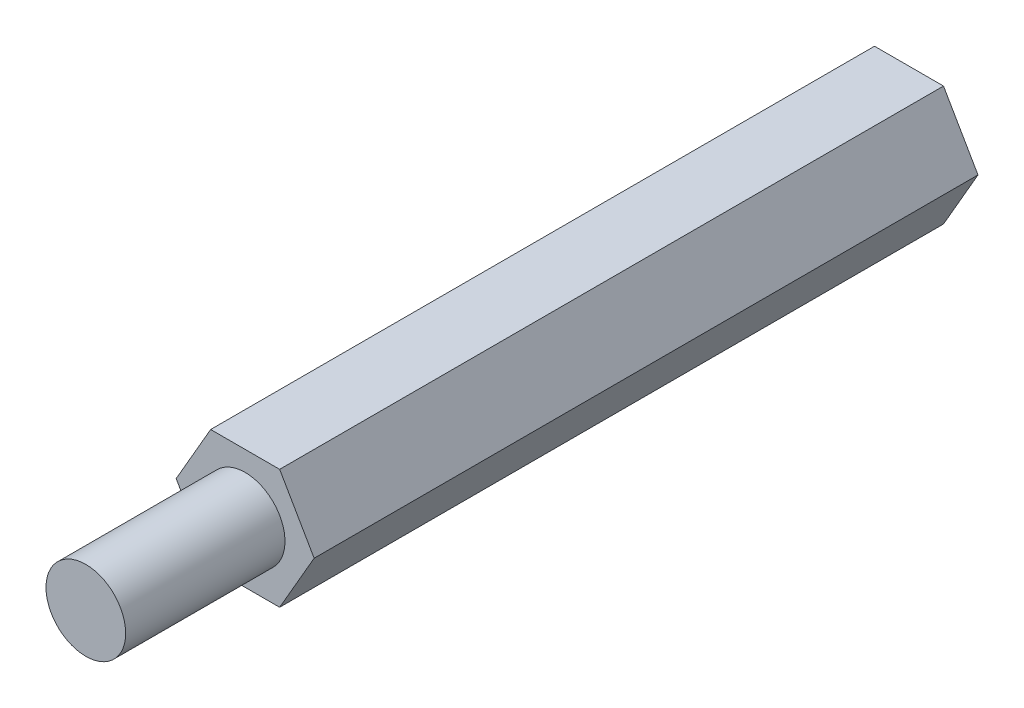
ISO-10303-21;
HEADER;
FILE_DESCRIPTION(('STEP AP214'),'2;1');
FILE_NAME('part.step','',(''),(''),'','','');
FILE_SCHEMA(('AUTOMOTIVE_DESIGN { 1 0 10303 214 1 1 1 1 }'));
ENDSEC;
DATA;
#1=APPLICATION_CONTEXT('core data for automotive mechanical design processes');
#2=APPLICATION_PROTOCOL_DEFINITION('international standard','automotive_design',2000,#1);
#3=PRODUCT_CONTEXT('',#1,'mechanical');
#4=PRODUCT('Part','Part','',(#3));
#5=PRODUCT_RELATED_PRODUCT_CATEGORY('part','',(#4));
#6=PRODUCT_DEFINITION_FORMATION('','',#4);
#7=PRODUCT_DEFINITION_CONTEXT('part definition',#1,'design');
#8=PRODUCT_DEFINITION('design','',#6,#7);
#9=PRODUCT_DEFINITION_SHAPE('','',#8);
#10=(LENGTH_UNIT() NAMED_UNIT(*) SI_UNIT(.MILLI.,.METRE.));
#11=(NAMED_UNIT(*) PLANE_ANGLE_UNIT() SI_UNIT($,.RADIAN.));
#12=(NAMED_UNIT(*) SI_UNIT($,.STERADIAN.) SOLID_ANGLE_UNIT());
#13=UNCERTAINTY_MEASURE_WITH_UNIT(LENGTH_MEASURE(1.E-05),#10,'distance_accuracy_value','');
#14=(GEOMETRIC_REPRESENTATION_CONTEXT(3) GLOBAL_UNCERTAINTY_ASSIGNED_CONTEXT((#13)) GLOBAL_UNIT_ASSIGNED_CONTEXT((#10,
#11,#12)) REPRESENTATION_CONTEXT('',''));
#15=CARTESIAN_POINT('',(0.,0.,0.));
#16=DIRECTION('',(0.,0.,1.));
#17=DIRECTION('',(1.,0.,0.));
#18=AXIS2_PLACEMENT_3D('',#15,#16,#17);
#19=CARTESIAN_POINT('',(0.,0.,6.));
#20=DIRECTION('',(0.,0.,-1.));
#21=DIRECTION('',(-1.,0.,0.));
#22=AXIS2_PLACEMENT_3D('',#19,#20,#21);
#23=CYLINDRICAL_SURFACE('',#22,1.5);
#24=CARTESIAN_POINT('',(0.,0.,6.));
#25=DIRECTION('',(0.,0.,1.));
#26=DIRECTION('',(1.,0.,0.));
#27=AXIS2_PLACEMENT_3D('',#24,#25,#26);
#28=CIRCLE('',#27,1.5);
#29=CARTESIAN_POINT('',(1.5,0.,6.));
#30=VERTEX_POINT('',#29);
#31=EDGE_CURVE('E11',#30,#30,#28,.T.);
#32=ORIENTED_EDGE('',*,*,#31,.F.);
#33=EDGE_LOOP('',(#32));
#34=FACE_BOUND('',#33,.T.);
#35=CARTESIAN_POINT('',(0.,0.,0.));
#36=DIRECTION('',(0.,0.,-1.));
#37=DIRECTION('',(-1.,0.,0.));
#38=AXIS2_PLACEMENT_3D('',#35,#36,#37);
#39=CIRCLE('',#38,1.5);
#40=CARTESIAN_POINT('',(-1.5,0.,0.));
#41=VERTEX_POINT('',#40);
#42=EDGE_CURVE('E44',#41,#41,#39,.T.);
#43=ORIENTED_EDGE('',*,*,#42,.F.);
#44=EDGE_LOOP('',(#43));
#45=FACE_BOUND('',#44,.T.);
#46=ADVANCED_FACE('F36',(#34,#45),#23,.T.);
#47=CARTESIAN_POINT('',(0.,0.,6.));
#48=DIRECTION('',(0.,0.,1.));
#49=DIRECTION('',(1.,0.,0.));
#50=AXIS2_PLACEMENT_3D('',#47,#48,#49);
#51=PLANE('',#50);
#52=ORIENTED_EDGE('',*,*,#31,.T.);
#53=EDGE_LOOP('',(#52));
#54=FACE_BOUND('',#53,.T.);
#55=ADVANCED_FACE('F146',(#54),#51,.T.);
#56=CARTESIAN_POINT('',(0.,0.,0.));
#57=DIRECTION('',(0.,0.,-1.));
#58=DIRECTION('',(-1.,0.,0.));
#59=AXIS2_PLACEMENT_3D('',#56,#57,#58);
#60=PLANE('',#59);
#61=DIRECTION('',(1.,0.,0.));
#62=VECTOR('',#61,1.);
#63=CARTESIAN_POINT('',(-1.29903810567666,2.25,0.));
#64=LINE('',#63,#62);
#65=CARTESIAN_POINT('',(-1.29903810567666,2.25,0.));
#66=VERTEX_POINT('',#65);
#67=CARTESIAN_POINT('',(1.29903810567666,2.25,0.));
#68=VERTEX_POINT('',#67);
#69=EDGE_CURVE('E121',#66,#68,#64,.T.);
#70=ORIENTED_EDGE('',*,*,#69,.F.);
#71=DIRECTION('',(0.5,0.866025403784438,0.));
#72=VECTOR('',#71,1.);
#73=CARTESIAN_POINT('',(-2.59807621135332,0.,0.));
#74=LINE('',#73,#72);
#75=CARTESIAN_POINT('',(-2.59807621135332,0.,0.));
#76=VERTEX_POINT('',#75);
#77=EDGE_CURVE('E81',#76,#66,#74,.T.);
#78=ORIENTED_EDGE('',*,*,#77,.F.);
#79=DIRECTION('',(-0.5,0.866025403784439,0.));
#80=VECTOR('',#79,1.);
#81=CARTESIAN_POINT('',(-1.29903810567666,-2.25,0.));
#82=LINE('',#81,#80);
#83=CARTESIAN_POINT('',(-1.29903810567666,-2.25,0.));
#84=VERTEX_POINT('',#83);
#85=EDGE_CURVE('E75',#84,#76,#82,.T.);
#86=ORIENTED_EDGE('',*,*,#85,.F.);
#87=DIRECTION('',(-1.,0.,0.));
#88=VECTOR('',#87,1.);
#89=CARTESIAN_POINT('',(1.29903810567666,-2.25,0.));
#90=LINE('',#89,#88);
#91=CARTESIAN_POINT('',(1.29903810567666,-2.25,0.));
#92=VERTEX_POINT('',#91);
#93=EDGE_CURVE('E111',#92,#84,#90,.T.);
#94=ORIENTED_EDGE('',*,*,#93,.F.);
#95=DIRECTION('',(-0.5,-0.866025403784438,0.));
#96=VECTOR('',#95,1.);
#97=CARTESIAN_POINT('',(2.59807621135332,0.,0.));
#98=LINE('',#97,#96);
#99=CARTESIAN_POINT('',(2.59807621135332,0.,0.));
#100=VERTEX_POINT('',#99);
#101=EDGE_CURVE('E127',#100,#92,#98,.T.);
#102=ORIENTED_EDGE('',*,*,#101,.F.);
#103=DIRECTION('',(0.5,-0.866025403784439,0.));
#104=VECTOR('',#103,1.);
#105=CARTESIAN_POINT('',(1.29903810567666,2.25,0.));
#106=LINE('',#105,#104);
#107=EDGE_CURVE('E124',#68,#100,#106,.T.);
#108=ORIENTED_EDGE('',*,*,#107,.F.);
#109=EDGE_LOOP('',(#70,#78,#86,#94,#102,#108));
#110=FACE_BOUND('',#109,.T.);
#111=ORIENTED_EDGE('',*,*,#42,.T.);
#112=EDGE_LOOP('',(#111));
#113=FACE_BOUND('',#112,.T.);
#114=ADVANCED_FACE('F143',(#110,#113),#60,.F.);
#115=CARTESIAN_POINT('',(-1.29903810567666,2.25,-25.));
#116=DIRECTION('',(0.,-1.,0.));
#117=DIRECTION('',(0.,0.,-1.));
#118=AXIS2_PLACEMENT_3D('',#115,#116,#117);
#119=PLANE('',#118);
#120=ORIENTED_EDGE('',*,*,#69,.T.);
#121=DIRECTION('',(0.,0.,1.));
#122=VECTOR('',#121,1.);
#123=CARTESIAN_POINT('',(1.29903810567666,2.25,-25.));
#124=LINE('',#123,#122);
#125=CARTESIAN_POINT('',(1.29903810567666,2.25,-25.));
#126=VERTEX_POINT('',#125);
#127=EDGE_CURVE('E139',#126,#68,#124,.T.);
#128=ORIENTED_EDGE('',*,*,#127,.F.);
#129=DIRECTION('',(1.,0.,0.));
#130=VECTOR('',#129,1.);
#131=CARTESIAN_POINT('',(-1.29903810567666,2.25,-25.));
#132=LINE('',#131,#130);
#133=CARTESIAN_POINT('',(-1.29903810567666,2.25,-25.));
#134=VERTEX_POINT('',#133);
#135=EDGE_CURVE('E132',#134,#126,#132,.T.);
#136=ORIENTED_EDGE('',*,*,#135,.F.);
#137=DIRECTION('',(0.,0.,1.));
#138=VECTOR('',#137,1.);
#139=CARTESIAN_POINT('',(-1.29903810567666,2.25,-25.));
#140=LINE('',#139,#138);
#141=EDGE_CURVE('E117',#134,#66,#140,.T.);
#142=ORIENTED_EDGE('',*,*,#141,.T.);
#143=EDGE_LOOP('',(#120,#128,#136,#142));
#144=FACE_BOUND('',#143,.T.);
#145=ADVANCED_FACE('F156',(#144),#119,.F.);
#146=CARTESIAN_POINT('',(1.29903810567666,2.25,-25.));
#147=DIRECTION('',(-0.866025403784439,-0.5,0.));
#148=DIRECTION('',(0.5,-0.866025403784439,0.));
#149=AXIS2_PLACEMENT_3D('',#146,#147,#148);
#150=PLANE('',#149);
#151=ORIENTED_EDGE('',*,*,#107,.T.);
#152=DIRECTION('',(0.,0.,1.));
#153=VECTOR('',#152,1.);
#154=CARTESIAN_POINT('',(2.59807621135332,0.,-25.));
#155=LINE('',#154,#153);
#156=CARTESIAN_POINT('',(2.59807621135332,0.,-25.));
#157=VERTEX_POINT('',#156);
#158=EDGE_CURVE('E136',#157,#100,#155,.T.);
#159=ORIENTED_EDGE('',*,*,#158,.F.);
#160=DIRECTION('',(0.5,-0.866025403784439,0.));
#161=VECTOR('',#160,1.);
#162=CARTESIAN_POINT('',(1.29903810567666,2.25,-25.));
#163=LINE('',#162,#161);
#164=EDGE_CURVE('E90',#126,#157,#163,.T.);
#165=ORIENTED_EDGE('',*,*,#164,.F.);
#166=ORIENTED_EDGE('',*,*,#127,.T.);
#167=EDGE_LOOP('',(#151,#159,#165,#166));
#168=FACE_BOUND('',#167,.T.);
#169=ADVANCED_FACE('F162',(#168),#150,.F.);
#170=CARTESIAN_POINT('',(2.59807621135332,0.,-25.));
#171=DIRECTION('',(-0.866025403784438,0.5,0.));
#172=DIRECTION('',(-0.5,-0.866025403784439,0.));
#173=AXIS2_PLACEMENT_3D('',#170,#171,#172);
#174=PLANE('',#173);
#175=ORIENTED_EDGE('',*,*,#101,.T.);
#176=DIRECTION('',(0.,0.,1.));
#177=VECTOR('',#176,1.);
#178=CARTESIAN_POINT('',(1.29903810567666,-2.25,-25.));
#179=LINE('',#178,#177);
#180=CARTESIAN_POINT('',(1.29903810567666,-2.25,-25.));
#181=VERTEX_POINT('',#180);
#182=EDGE_CURVE('E112',#181,#92,#179,.T.);
#183=ORIENTED_EDGE('',*,*,#182,.F.);
#184=DIRECTION('',(-0.5,-0.866025403784438,0.));
#185=VECTOR('',#184,1.);
#186=CARTESIAN_POINT('',(2.59807621135332,0.,-25.));
#187=LINE('',#186,#185);
#188=EDGE_CURVE('E103',#157,#181,#187,.T.);
#189=ORIENTED_EDGE('',*,*,#188,.F.);
#190=ORIENTED_EDGE('',*,*,#158,.T.);
#191=EDGE_LOOP('',(#175,#183,#189,#190));
#192=FACE_BOUND('',#191,.T.);
#193=ADVANCED_FACE('F166',(#192),#174,.F.);
#194=CARTESIAN_POINT('',(1.29903810567666,-2.25,-25.));
#195=DIRECTION('',(0.,1.,0.));
#196=DIRECTION('',(-1.,0.,0.));
#197=AXIS2_PLACEMENT_3D('',#194,#195,#196);
#198=PLANE('',#197);
#199=ORIENTED_EDGE('',*,*,#93,.T.);
#200=DIRECTION('',(0.,0.,1.));
#201=VECTOR('',#200,1.);
#202=CARTESIAN_POINT('',(-1.29903810567666,-2.25,-25.));
#203=LINE('',#202,#201);
#204=CARTESIAN_POINT('',(-1.29903810567666,-2.25,-25.));
#205=VERTEX_POINT('',#204);
#206=EDGE_CURVE('E108',#205,#84,#203,.T.);
#207=ORIENTED_EDGE('',*,*,#206,.F.);
#208=DIRECTION('',(-1.,0.,0.));
#209=VECTOR('',#208,1.);
#210=CARTESIAN_POINT('',(1.29903810567666,-2.25,-25.));
#211=LINE('',#210,#209);
#212=EDGE_CURVE('E97',#181,#205,#211,.T.);
#213=ORIENTED_EDGE('',*,*,#212,.F.);
#214=ORIENTED_EDGE('',*,*,#182,.T.);
#215=EDGE_LOOP('',(#199,#207,#213,#214));
#216=FACE_BOUND('',#215,.T.);
#217=ADVANCED_FACE('F109',(#216),#198,.F.);
#218=CARTESIAN_POINT('',(-1.29903810567666,-2.25,-25.));
#219=DIRECTION('',(0.866025403784439,0.5,0.));
#220=DIRECTION('',(-0.5,0.866025403784439,0.));
#221=AXIS2_PLACEMENT_3D('',#218,#219,#220);
#222=PLANE('',#221);
#223=ORIENTED_EDGE('',*,*,#85,.T.);
#224=DIRECTION('',(0.,0.,1.));
#225=VECTOR('',#224,1.);
#226=CARTESIAN_POINT('',(-2.59807621135332,0.,-25.));
#227=LINE('',#226,#225);
#228=CARTESIAN_POINT('',(-2.59807621135332,0.,-25.));
#229=VERTEX_POINT('',#228);
#230=EDGE_CURVE('E113',#229,#76,#227,.T.);
#231=ORIENTED_EDGE('',*,*,#230,.F.);
#232=DIRECTION('',(-0.5,0.866025403784439,0.));
#233=VECTOR('',#232,1.);
#234=CARTESIAN_POINT('',(-1.29903810567666,-2.25,-25.));
#235=LINE('',#234,#233);
#236=EDGE_CURVE('E101',#205,#229,#235,.T.);
#237=ORIENTED_EDGE('',*,*,#236,.F.);
#238=ORIENTED_EDGE('',*,*,#206,.T.);
#239=EDGE_LOOP('',(#223,#231,#237,#238));
#240=FACE_BOUND('',#239,.T.);
#241=ADVANCED_FACE('F115',(#240),#222,.F.);
#242=CARTESIAN_POINT('',(-2.59807621135332,0.,-25.));
#243=DIRECTION('',(0.866025403784438,-0.5,0.));
#244=DIRECTION('',(0.5,0.866025403784438,0.));
#245=AXIS2_PLACEMENT_3D('',#242,#243,#244);
#246=PLANE('',#245);
#247=ORIENTED_EDGE('',*,*,#77,.T.);
#248=ORIENTED_EDGE('',*,*,#141,.F.);
#249=DIRECTION('',(0.5,0.866025403784438,0.));
#250=VECTOR('',#249,1.);
#251=CARTESIAN_POINT('',(-2.59807621135332,0.,-25.));
#252=LINE('',#251,#250);
#253=EDGE_CURVE('E52',#229,#134,#252,.T.);
#254=ORIENTED_EDGE('',*,*,#253,.F.);
#255=ORIENTED_EDGE('',*,*,#230,.T.);
#256=EDGE_LOOP('',(#247,#248,#254,#255));
#257=FACE_BOUND('',#256,.T.);
#258=ADVANCED_FACE('F174',(#257),#246,.F.);
#259=CARTESIAN_POINT('',(0.,0.,-25.));
#260=DIRECTION('',(0.,0.,-1.));
#261=DIRECTION('',(-1.,0.,0.));
#262=AXIS2_PLACEMENT_3D('',#259,#260,#261);
#263=PLANE('',#262);
#264=CARTESIAN_POINT('',(0.,0.,-25.));
#265=DIRECTION('',(0.,0.,-1.));
#266=DIRECTION('',(-1.,0.,0.));
#267=AXIS2_PLACEMENT_3D('',#264,#265,#266);
#268=CIRCLE('',#267,1.5);
#269=CARTESIAN_POINT('',(-1.5,0.,-25.));
#270=VERTEX_POINT('',#269);
#271=EDGE_CURVE('E191',#270,#270,#268,.T.);
#272=ORIENTED_EDGE('',*,*,#271,.F.);
#273=EDGE_LOOP('',(#272));
#274=FACE_BOUND('',#273,.T.);
#275=ORIENTED_EDGE('',*,*,#135,.T.);
#276=ORIENTED_EDGE('',*,*,#164,.T.);
#277=ORIENTED_EDGE('',*,*,#188,.T.);
#278=ORIENTED_EDGE('',*,*,#212,.T.);
#279=ORIENTED_EDGE('',*,*,#236,.T.);
#280=ORIENTED_EDGE('',*,*,#253,.T.);
#281=EDGE_LOOP('',(#275,#276,#277,#278,#279,#280));
#282=FACE_BOUND('',#281,.T.);
#283=ADVANCED_FACE('F99',(#274,#282),#263,.T.);
#284=CARTESIAN_POINT('',(0.,0.,-20.5));
#285=DIRECTION('',(0.,0.,-1.));
#286=DIRECTION('',(-1.,0.,0.));
#287=AXIS2_PLACEMENT_3D('',#284,#285,#286);
#288=CYLINDRICAL_SURFACE('',#287,1.5);
#289=CARTESIAN_POINT('',(0.,0.,-20.5));
#290=DIRECTION('',(0.,0.,-1.));
#291=DIRECTION('',(-1.,0.,0.));
#292=AXIS2_PLACEMENT_3D('',#289,#290,#291);
#293=CIRCLE('',#292,1.5);
#294=CARTESIAN_POINT('',(-1.5,0.,-20.5));
#295=VERTEX_POINT('',#294);
#296=EDGE_CURVE('E125',#295,#295,#293,.T.);
#297=ORIENTED_EDGE('',*,*,#296,.F.);
#298=EDGE_LOOP('',(#297));
#299=FACE_BOUND('',#298,.T.);
#300=ORIENTED_EDGE('',*,*,#271,.T.);
#301=EDGE_LOOP('',(#300));
#302=FACE_BOUND('',#301,.T.);
#303=ADVANCED_FACE('F179',(#299,#302),#288,.F.);
#304=CARTESIAN_POINT('',(0.,0.,-20.5));
#305=DIRECTION('',(0.,0.,-1.));
#306=DIRECTION('',(-1.,0.,0.));
#307=AXIS2_PLACEMENT_3D('',#304,#305,#306);
#308=PLANE('',#307);
#309=ORIENTED_EDGE('',*,*,#296,.T.);
#310=EDGE_LOOP('',(#309));
#311=FACE_BOUND('',#310,.T.);
#312=ADVANCED_FACE('F183',(#311),#308,.T.);
#313=CLOSED_SHELL('',(#46,#55,#114,#145,#169,#193,#217,#241,#258,#283,#303,#312));
#314=MANIFOLD_SOLID_BREP('B2',#313);
#315=ADVANCED_BREP_SHAPE_REPRESENTATION('',(#18,#314),#14);
#316=SHAPE_DEFINITION_REPRESENTATION(#9,#315);
ENDSEC;
END-ISO-10303-21;
